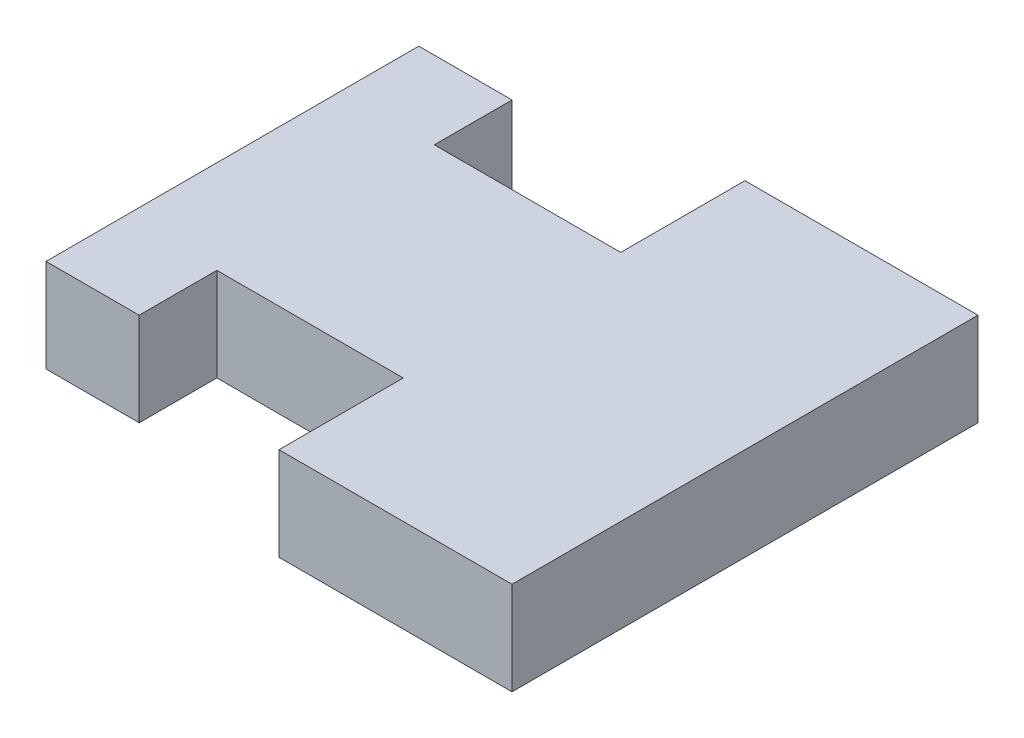
ISO-10303-21;
HEADER;
FILE_DESCRIPTION(('STEP AP214'),'2;1');
FILE_NAME('part.step','',(''),(''),'','','');
FILE_SCHEMA(('AUTOMOTIVE_DESIGN { 1 0 10303 214 1 1 1 1 }'));
ENDSEC;
DATA;
#1=APPLICATION_CONTEXT('core data for automotive mechanical design processes');
#2=APPLICATION_PROTOCOL_DEFINITION('international standard','automotive_design',2000,#1);
#3=PRODUCT_CONTEXT('',#1,'mechanical');
#4=PRODUCT('Part','Part','',(#3));
#5=PRODUCT_RELATED_PRODUCT_CATEGORY('part','',(#4));
#6=PRODUCT_DEFINITION_FORMATION('','',#4);
#7=PRODUCT_DEFINITION_CONTEXT('part definition',#1,'design');
#8=PRODUCT_DEFINITION('design','',#6,#7);
#9=PRODUCT_DEFINITION_SHAPE('','',#8);
#10=(LENGTH_UNIT() NAMED_UNIT(*) SI_UNIT(.MILLI.,.METRE.));
#11=(NAMED_UNIT(*) PLANE_ANGLE_UNIT() SI_UNIT($,.RADIAN.));
#12=(NAMED_UNIT(*) SI_UNIT($,.STERADIAN.) SOLID_ANGLE_UNIT());
#13=UNCERTAINTY_MEASURE_WITH_UNIT(LENGTH_MEASURE(1.E-05),#10,'distance_accuracy_value','');
#14=(GEOMETRIC_REPRESENTATION_CONTEXT(3) GLOBAL_UNCERTAINTY_ASSIGNED_CONTEXT((#13)) GLOBAL_UNIT_ASSIGNED_CONTEXT((#10,
#11,#12)) REPRESENTATION_CONTEXT('',''));
#15=CARTESIAN_POINT('',(0.,0.,0.));
#16=DIRECTION('',(0.,0.,1.));
#17=DIRECTION('',(1.,0.,0.));
#18=AXIS2_PLACEMENT_3D('',#15,#16,#17);
#19=CARTESIAN_POINT('',(0.,0.3,-1.49999999999998));
#20=DIRECTION('',(-1.,0.,0.));
#21=DIRECTION('',(0.,0.,1.));
#22=AXIS2_PLACEMENT_3D('',#19,#20,#21);
#23=PLANE('',#22);
#24=DIRECTION('',(0.,0.,-1.));
#25=VECTOR('',#24,1.);
#26=CARTESIAN_POINT('',(0.,0.,-1.49999999999998));
#27=LINE('',#26,#25);
#28=CARTESIAN_POINT('',(0.,0.,0.));
#29=VERTEX_POINT('',#28);
#30=CARTESIAN_POINT('',(0.,0.,-1.49999999999998));
#31=VERTEX_POINT('',#30);
#32=EDGE_CURVE('E189',#29,#31,#27,.T.);
#33=ORIENTED_EDGE('',*,*,#32,.T.);
#34=DIRECTION('',(0.,-1.,0.));
#35=VECTOR('',#34,1.);
#36=CARTESIAN_POINT('',(0.,0.3,-1.49999999999998));
#37=LINE('',#36,#35);
#38=CARTESIAN_POINT('',(0.,0.3,-1.49999999999998));
#39=VERTEX_POINT('',#38);
#40=EDGE_CURVE('E11',#39,#31,#37,.T.);
#41=ORIENTED_EDGE('',*,*,#40,.F.);
#42=DIRECTION('',(0.,0.,-1.));
#43=VECTOR('',#42,1.);
#44=CARTESIAN_POINT('',(0.,0.3,-1.49999999999998));
#45=LINE('',#44,#43);
#46=CARTESIAN_POINT('',(0.,0.3,0.));
#47=VERTEX_POINT('',#46);
#48=EDGE_CURVE('E222',#47,#39,#45,.T.);
#49=ORIENTED_EDGE('',*,*,#48,.F.);
#50=DIRECTION('',(0.,-1.,0.));
#51=VECTOR('',#50,1.);
#52=CARTESIAN_POINT('',(0.,0.3,0.));
#53=LINE('',#52,#51);
#54=EDGE_CURVE('E185',#47,#29,#53,.T.);
#55=ORIENTED_EDGE('',*,*,#54,.T.);
#56=EDGE_LOOP('',(#33,#41,#49,#55));
#57=FACE_BOUND('',#56,.T.);
#58=ADVANCED_FACE('F39',(#57),#23,.F.);
#59=CARTESIAN_POINT('',(0.,0.3,-1.49999999999998));
#60=DIRECTION('',(0.,0.,1.));
#61=DIRECTION('',(1.,0.,0.));
#62=AXIS2_PLACEMENT_3D('',#59,#60,#61);
#63=PLANE('',#62);
#64=DIRECTION('',(-1.,0.,0.));
#65=VECTOR('',#64,1.);
#66=CARTESIAN_POINT('',(0.,0.,-1.49999999999998));
#67=LINE('',#66,#65);
#68=CARTESIAN_POINT('',(-0.75,0.,-1.49999999999998));
#69=VERTEX_POINT('',#68);
#70=EDGE_CURVE('E193',#31,#69,#67,.T.);
#71=ORIENTED_EDGE('',*,*,#70,.T.);
#72=DIRECTION('',(0.,-1.,0.));
#73=VECTOR('',#72,1.);
#74=CARTESIAN_POINT('',(-0.75,0.3,-1.49999999999998));
#75=LINE('',#74,#73);
#76=CARTESIAN_POINT('',(-0.75,0.3,-1.49999999999998));
#77=VERTEX_POINT('',#76);
#78=EDGE_CURVE('E48',#77,#69,#75,.T.);
#79=ORIENTED_EDGE('',*,*,#78,.F.);
#80=DIRECTION('',(-1.,0.,0.));
#81=VECTOR('',#80,1.);
#82=CARTESIAN_POINT('',(0.,0.3,-1.49999999999998));
#83=LINE('',#82,#81);
#84=EDGE_CURVE('E126',#39,#77,#83,.T.);
#85=ORIENTED_EDGE('',*,*,#84,.F.);
#86=ORIENTED_EDGE('',*,*,#40,.T.);
#87=EDGE_LOOP('',(#71,#79,#85,#86));
#88=FACE_BOUND('',#87,.T.);
#89=ADVANCED_FACE('F316',(#88),#63,.F.);
#90=CARTESIAN_POINT('',(-0.75,0.3,-1.49999999999998));
#91=DIRECTION('',(1.,0.,0.));
#92=DIRECTION('',(0.,0.,-1.));
#93=AXIS2_PLACEMENT_3D('',#90,#91,#92);
#94=PLANE('',#93);
#95=DIRECTION('',(0.,0.,1.));
#96=VECTOR('',#95,1.);
#97=CARTESIAN_POINT('',(-0.75,0.,-1.49999999999998));
#98=LINE('',#97,#96);
#99=CARTESIAN_POINT('',(-0.75,0.,-1.09999999999999));
#100=VERTEX_POINT('',#99);
#101=EDGE_CURVE('E196',#69,#100,#98,.T.);
#102=ORIENTED_EDGE('',*,*,#101,.T.);
#103=DIRECTION('',(0.,-1.,0.));
#104=VECTOR('',#103,1.);
#105=CARTESIAN_POINT('',(-0.75,0.3,-1.09999999999999));
#106=LINE('',#105,#104);
#107=CARTESIAN_POINT('',(-0.75,0.3,-1.09999999999999));
#108=VERTEX_POINT('',#107);
#109=EDGE_CURVE('E249',#108,#100,#106,.T.);
#110=ORIENTED_EDGE('',*,*,#109,.F.);
#111=DIRECTION('',(0.,0.,1.));
#112=VECTOR('',#111,1.);
#113=CARTESIAN_POINT('',(-0.75,0.3,-1.49999999999998));
#114=LINE('',#113,#112);
#115=EDGE_CURVE('E259',#77,#108,#114,.T.);
#116=ORIENTED_EDGE('',*,*,#115,.F.);
#117=ORIENTED_EDGE('',*,*,#78,.T.);
#118=EDGE_LOOP('',(#102,#110,#116,#117));
#119=FACE_BOUND('',#118,.T.);
#120=ADVANCED_FACE('F257',(#119),#94,.F.);
#121=CARTESIAN_POINT('',(-0.75,0.3,-1.09999999999999));
#122=DIRECTION('',(0.,0.,1.));
#123=DIRECTION('',(1.,0.,0.));
#124=AXIS2_PLACEMENT_3D('',#121,#122,#123);
#125=PLANE('',#124);
#126=DIRECTION('',(-1.,0.,0.));
#127=VECTOR('',#126,1.);
#128=CARTESIAN_POINT('',(-0.75,0.,-1.09999999999999));
#129=LINE('',#128,#127);
#130=CARTESIAN_POINT('',(-1.35,0.,-1.09999999999999));
#131=VERTEX_POINT('',#130);
#132=EDGE_CURVE('E199',#100,#131,#129,.T.);
#133=ORIENTED_EDGE('',*,*,#132,.T.);
#134=DIRECTION('',(0.,-1.,0.));
#135=VECTOR('',#134,1.);
#136=CARTESIAN_POINT('',(-1.35,0.3,-1.09999999999999));
#137=LINE('',#136,#135);
#138=CARTESIAN_POINT('',(-1.35,0.3,-1.09999999999999));
#139=VERTEX_POINT('',#138);
#140=EDGE_CURVE('E245',#139,#131,#137,.T.);
#141=ORIENTED_EDGE('',*,*,#140,.F.);
#142=DIRECTION('',(-1.,0.,0.));
#143=VECTOR('',#142,1.);
#144=CARTESIAN_POINT('',(-0.75,0.3,-1.09999999999999));
#145=LINE('',#144,#143);
#146=EDGE_CURVE('E278',#108,#139,#145,.T.);
#147=ORIENTED_EDGE('',*,*,#146,.F.);
#148=ORIENTED_EDGE('',*,*,#109,.T.);
#149=EDGE_LOOP('',(#133,#141,#147,#148));
#150=FACE_BOUND('',#149,.T.);
#151=ADVANCED_FACE('F268',(#150),#125,.F.);
#152=CARTESIAN_POINT('',(-1.35,0.3,-1.34999999999999));
#153=DIRECTION('',(-1.,0.,0.));
#154=DIRECTION('',(0.,0.,1.));
#155=AXIS2_PLACEMENT_3D('',#152,#153,#154);
#156=PLANE('',#155);
#157=DIRECTION('',(0.,0.,-1.));
#158=VECTOR('',#157,1.);
#159=CARTESIAN_POINT('',(-1.35,0.,-1.34999999999999));
#160=LINE('',#159,#158);
#161=CARTESIAN_POINT('',(-1.35,0.,-1.34999999999999));
#162=VERTEX_POINT('',#161);
#163=EDGE_CURVE('E202',#131,#162,#160,.T.);
#164=ORIENTED_EDGE('',*,*,#163,.T.);
#165=DIRECTION('',(0.,-1.,0.));
#166=VECTOR('',#165,1.);
#167=CARTESIAN_POINT('',(-1.35,0.3,-1.34999999999999));
#168=LINE('',#167,#166);
#169=CARTESIAN_POINT('',(-1.35,0.3,-1.34999999999999));
#170=VERTEX_POINT('',#169);
#171=EDGE_CURVE('E241',#170,#162,#168,.T.);
#172=ORIENTED_EDGE('',*,*,#171,.F.);
#173=DIRECTION('',(0.,0.,-1.));
#174=VECTOR('',#173,1.);
#175=CARTESIAN_POINT('',(-1.35,0.3,-1.34999999999999));
#176=LINE('',#175,#174);
#177=EDGE_CURVE('E274',#139,#170,#176,.T.);
#178=ORIENTED_EDGE('',*,*,#177,.F.);
#179=ORIENTED_EDGE('',*,*,#140,.T.);
#180=EDGE_LOOP('',(#164,#172,#178,#179));
#181=FACE_BOUND('',#180,.T.);
#182=ADVANCED_FACE('F272',(#181),#156,.F.);
#183=CARTESIAN_POINT('',(-1.65,0.3,-1.34999999999999));
#184=DIRECTION('',(0.,0.,1.));
#185=DIRECTION('',(1.,0.,0.));
#186=AXIS2_PLACEMENT_3D('',#183,#184,#185);
#187=PLANE('',#186);
#188=DIRECTION('',(-1.,0.,0.));
#189=VECTOR('',#188,1.);
#190=CARTESIAN_POINT('',(-1.65,0.,-1.34999999999999));
#191=LINE('',#190,#189);
#192=CARTESIAN_POINT('',(-1.65,0.,-1.34999999999999));
#193=VERTEX_POINT('',#192);
#194=EDGE_CURVE('E205',#162,#193,#191,.T.);
#195=ORIENTED_EDGE('',*,*,#194,.T.);
#196=DIRECTION('',(0.,-1.,0.));
#197=VECTOR('',#196,1.);
#198=CARTESIAN_POINT('',(-1.65,0.3,-1.34999999999999));
#199=LINE('',#198,#197);
#200=CARTESIAN_POINT('',(-1.65,0.3,-1.34999999999999));
#201=VERTEX_POINT('',#200);
#202=EDGE_CURVE('E237',#201,#193,#199,.T.);
#203=ORIENTED_EDGE('',*,*,#202,.F.);
#204=DIRECTION('',(-1.,0.,0.));
#205=VECTOR('',#204,1.);
#206=CARTESIAN_POINT('',(-1.65,0.3,-1.34999999999999));
#207=LINE('',#206,#205);
#208=EDGE_CURVE('E277',#170,#201,#207,.T.);
#209=ORIENTED_EDGE('',*,*,#208,.F.);
#210=ORIENTED_EDGE('',*,*,#171,.T.);
#211=EDGE_LOOP('',(#195,#203,#209,#210));
#212=FACE_BOUND('',#211,.T.);
#213=ADVANCED_FACE('F329',(#212),#187,.F.);
#214=CARTESIAN_POINT('',(-1.65,0.3,-0.149999999999992));
#215=DIRECTION('',(1.,0.,0.));
#216=DIRECTION('',(0.,0.,-1.));
#217=AXIS2_PLACEMENT_3D('',#214,#215,#216);
#218=PLANE('',#217);
#219=DIRECTION('',(0.,0.,1.));
#220=VECTOR('',#219,1.);
#221=CARTESIAN_POINT('',(-1.65,0.,-0.149999999999992));
#222=LINE('',#221,#220);
#223=CARTESIAN_POINT('',(-1.65,0.,-0.149999999999992));
#224=VERTEX_POINT('',#223);
#225=EDGE_CURVE('E208',#193,#224,#222,.T.);
#226=ORIENTED_EDGE('',*,*,#225,.T.);
#227=DIRECTION('',(0.,-1.,0.));
#228=VECTOR('',#227,1.);
#229=CARTESIAN_POINT('',(-1.65,0.3,-0.149999999999992));
#230=LINE('',#229,#228);
#231=CARTESIAN_POINT('',(-1.65,0.3,-0.149999999999992));
#232=VERTEX_POINT('',#231);
#233=EDGE_CURVE('E233',#232,#224,#230,.T.);
#234=ORIENTED_EDGE('',*,*,#233,.F.);
#235=DIRECTION('',(0.,0.,1.));
#236=VECTOR('',#235,1.);
#237=CARTESIAN_POINT('',(-1.65,0.3,-0.149999999999992));
#238=LINE('',#237,#236);
#239=EDGE_CURVE('E281',#201,#232,#238,.T.);
#240=ORIENTED_EDGE('',*,*,#239,.F.);
#241=ORIENTED_EDGE('',*,*,#202,.T.);
#242=EDGE_LOOP('',(#226,#234,#240,#241));
#243=FACE_BOUND('',#242,.T.);
#244=ADVANCED_FACE('F332',(#243),#218,.F.);
#245=CARTESIAN_POINT('',(-1.35,0.3,-0.149999999999992));
#246=DIRECTION('',(0.,0.,-1.));
#247=DIRECTION('',(-1.,0.,0.));
#248=AXIS2_PLACEMENT_3D('',#245,#246,#247);
#249=PLANE('',#248);
#250=DIRECTION('',(1.,0.,0.));
#251=VECTOR('',#250,1.);
#252=CARTESIAN_POINT('',(-1.35,0.,-0.149999999999992));
#253=LINE('',#252,#251);
#254=CARTESIAN_POINT('',(-1.35,0.,-0.149999999999992));
#255=VERTEX_POINT('',#254);
#256=EDGE_CURVE('E211',#224,#255,#253,.T.);
#257=ORIENTED_EDGE('',*,*,#256,.T.);
#258=DIRECTION('',(0.,-1.,0.));
#259=VECTOR('',#258,1.);
#260=CARTESIAN_POINT('',(-1.35,0.3,-0.149999999999992));
#261=LINE('',#260,#259);
#262=CARTESIAN_POINT('',(-1.35,0.3,-0.149999999999992));
#263=VERTEX_POINT('',#262);
#264=EDGE_CURVE('E229',#263,#255,#261,.T.);
#265=ORIENTED_EDGE('',*,*,#264,.F.);
#266=DIRECTION('',(1.,0.,0.));
#267=VECTOR('',#266,1.);
#268=CARTESIAN_POINT('',(-1.35,0.3,-0.149999999999992));
#269=LINE('',#268,#267);
#270=EDGE_CURVE('E289',#232,#263,#269,.T.);
#271=ORIENTED_EDGE('',*,*,#270,.F.);
#272=ORIENTED_EDGE('',*,*,#233,.T.);
#273=EDGE_LOOP('',(#257,#265,#271,#272));
#274=FACE_BOUND('',#273,.T.);
#275=ADVANCED_FACE('F297',(#274),#249,.F.);
#276=CARTESIAN_POINT('',(-1.35,0.3,-0.399999999999992));
#277=DIRECTION('',(-1.,0.,0.));
#278=DIRECTION('',(0.,0.,1.));
#279=AXIS2_PLACEMENT_3D('',#276,#277,#278);
#280=PLANE('',#279);
#281=DIRECTION('',(0.,0.,-1.));
#282=VECTOR('',#281,1.);
#283=CARTESIAN_POINT('',(-1.35,0.,-0.399999999999992));
#284=LINE('',#283,#282);
#285=CARTESIAN_POINT('',(-1.35,0.,-0.399999999999992));
#286=VERTEX_POINT('',#285);
#287=EDGE_CURVE('E213',#255,#286,#284,.T.);
#288=ORIENTED_EDGE('',*,*,#287,.T.);
#289=DIRECTION('',(0.,-1.,0.));
#290=VECTOR('',#289,1.);
#291=CARTESIAN_POINT('',(-1.35,0.3,-0.399999999999992));
#292=LINE('',#291,#290);
#293=CARTESIAN_POINT('',(-1.35,0.3,-0.399999999999992));
#294=VERTEX_POINT('',#293);
#295=EDGE_CURVE('E177',#294,#286,#292,.T.);
#296=ORIENTED_EDGE('',*,*,#295,.F.);
#297=DIRECTION('',(0.,0.,-1.));
#298=VECTOR('',#297,1.);
#299=CARTESIAN_POINT('',(-1.35,0.3,-0.399999999999992));
#300=LINE('',#299,#298);
#301=EDGE_CURVE('E166',#263,#294,#300,.T.);
#302=ORIENTED_EDGE('',*,*,#301,.F.);
#303=ORIENTED_EDGE('',*,*,#264,.T.);
#304=EDGE_LOOP('',(#288,#296,#302,#303));
#305=FACE_BOUND('',#304,.T.);
#306=ADVANCED_FACE('F301',(#305),#280,.F.);
#307=CARTESIAN_POINT('',(-1.35,0.3,-0.399999999999992));
#308=DIRECTION('',(0.,0.,-1.));
#309=DIRECTION('',(-1.,0.,0.));
#310=AXIS2_PLACEMENT_3D('',#307,#308,#309);
#311=PLANE('',#310);
#312=DIRECTION('',(1.,0.,0.));
#313=VECTOR('',#312,1.);
#314=CARTESIAN_POINT('',(-1.35,0.,-0.399999999999992));
#315=LINE('',#314,#313);
#316=CARTESIAN_POINT('',(-0.75,0.,-0.399999999999992));
#317=VERTEX_POINT('',#316);
#318=EDGE_CURVE('E175',#286,#317,#315,.T.);
#319=ORIENTED_EDGE('',*,*,#318,.T.);
#320=DIRECTION('',(0.,-1.,0.));
#321=VECTOR('',#320,1.);
#322=CARTESIAN_POINT('',(-0.75,0.3,-0.399999999999992));
#323=LINE('',#322,#321);
#324=CARTESIAN_POINT('',(-0.75,0.3,-0.399999999999992));
#325=VERTEX_POINT('',#324);
#326=EDGE_CURVE('E172',#325,#317,#323,.T.);
#327=ORIENTED_EDGE('',*,*,#326,.F.);
#328=DIRECTION('',(1.,0.,0.));
#329=VECTOR('',#328,1.);
#330=CARTESIAN_POINT('',(-1.35,0.3,-0.399999999999992));
#331=LINE('',#330,#329);
#332=EDGE_CURVE('E160',#294,#325,#331,.T.);
#333=ORIENTED_EDGE('',*,*,#332,.F.);
#334=ORIENTED_EDGE('',*,*,#295,.T.);
#335=EDGE_LOOP('',(#319,#327,#333,#334));
#336=FACE_BOUND('',#335,.T.);
#337=ADVANCED_FACE('F173',(#336),#311,.F.);
#338=CARTESIAN_POINT('',(-0.75,0.3,-0.399999999999992));
#339=DIRECTION('',(1.,0.,0.));
#340=DIRECTION('',(0.,0.,-1.));
#341=AXIS2_PLACEMENT_3D('',#338,#339,#340);
#342=PLANE('',#341);
#343=DIRECTION('',(0.,0.,1.));
#344=VECTOR('',#343,1.);
#345=CARTESIAN_POINT('',(-0.75,0.,-0.399999999999992));
#346=LINE('',#345,#344);
#347=CARTESIAN_POINT('',(-0.75,0.,0.));
#348=VERTEX_POINT('',#347);
#349=EDGE_CURVE('E111',#317,#348,#346,.T.);
#350=ORIENTED_EDGE('',*,*,#349,.T.);
#351=DIRECTION('',(0.,-1.,0.));
#352=VECTOR('',#351,1.);
#353=CARTESIAN_POINT('',(-0.75,0.3,0.));
#354=LINE('',#353,#352);
#355=CARTESIAN_POINT('',(-0.75,0.3,0.));
#356=VERTEX_POINT('',#355);
#357=EDGE_CURVE('E178',#356,#348,#354,.T.);
#358=ORIENTED_EDGE('',*,*,#357,.F.);
#359=DIRECTION('',(0.,0.,1.));
#360=VECTOR('',#359,1.);
#361=CARTESIAN_POINT('',(-0.75,0.3,-0.399999999999992));
#362=LINE('',#361,#360);
#363=EDGE_CURVE('E164',#325,#356,#362,.T.);
#364=ORIENTED_EDGE('',*,*,#363,.F.);
#365=ORIENTED_EDGE('',*,*,#326,.T.);
#366=EDGE_LOOP('',(#350,#358,#364,#365));
#367=FACE_BOUND('',#366,.T.);
#368=ADVANCED_FACE('F180',(#367),#342,.F.);
#369=CARTESIAN_POINT('',(-0.75,0.3,0.));
#370=DIRECTION('',(0.,0.,-1.));
#371=DIRECTION('',(-1.,0.,0.));
#372=AXIS2_PLACEMENT_3D('',#369,#370,#371);
#373=PLANE('',#372);
#374=DIRECTION('',(1.,0.,0.));
#375=VECTOR('',#374,1.);
#376=CARTESIAN_POINT('',(-0.75,0.,0.));
#377=LINE('',#376,#375);
#378=EDGE_CURVE('E117',#348,#29,#377,.T.);
#379=ORIENTED_EDGE('',*,*,#378,.T.);
#380=ORIENTED_EDGE('',*,*,#54,.F.);
#381=DIRECTION('',(1.,0.,0.));
#382=VECTOR('',#381,1.);
#383=CARTESIAN_POINT('',(-0.75,0.3,0.));
#384=LINE('',#383,#382);
#385=EDGE_CURVE('E59',#356,#47,#384,.T.);
#386=ORIENTED_EDGE('',*,*,#385,.F.);
#387=ORIENTED_EDGE('',*,*,#357,.T.);
#388=EDGE_LOOP('',(#379,#380,#386,#387));
#389=FACE_BOUND('',#388,.T.);
#390=ADVANCED_FACE('F305',(#389),#373,.F.);
#391=CARTESIAN_POINT('',(0.,0.3,0.));
#392=DIRECTION('',(0.,1.,0.));
#393=DIRECTION('',(0.,0.,1.));
#394=AXIS2_PLACEMENT_3D('',#391,#392,#393);
#395=PLANE('',#394);
#396=ORIENTED_EDGE('',*,*,#48,.T.);
#397=ORIENTED_EDGE('',*,*,#84,.T.);
#398=ORIENTED_EDGE('',*,*,#115,.T.);
#399=ORIENTED_EDGE('',*,*,#146,.T.);
#400=ORIENTED_EDGE('',*,*,#177,.T.);
#401=ORIENTED_EDGE('',*,*,#208,.T.);
#402=ORIENTED_EDGE('',*,*,#239,.T.);
#403=ORIENTED_EDGE('',*,*,#270,.T.);
#404=ORIENTED_EDGE('',*,*,#301,.T.);
#405=ORIENTED_EDGE('',*,*,#332,.T.);
#406=ORIENTED_EDGE('',*,*,#363,.T.);
#407=ORIENTED_EDGE('',*,*,#385,.T.);
#408=EDGE_LOOP('',(#396,#397,#398,#399,#400,#401,#402,#403,#404,#405,#406,#407));
#409=FACE_BOUND('',#408,.T.);
#410=ADVANCED_FACE('F162',(#409),#395,.T.);
#411=CARTESIAN_POINT('',(0.,0.,0.));
#412=DIRECTION('',(0.,1.,0.));
#413=DIRECTION('',(0.,0.,1.));
#414=AXIS2_PLACEMENT_3D('',#411,#412,#413);
#415=PLANE('',#414);
#416=ORIENTED_EDGE('',*,*,#32,.F.);
#417=ORIENTED_EDGE('',*,*,#378,.F.);
#418=ORIENTED_EDGE('',*,*,#349,.F.);
#419=ORIENTED_EDGE('',*,*,#318,.F.);
#420=ORIENTED_EDGE('',*,*,#287,.F.);
#421=ORIENTED_EDGE('',*,*,#256,.F.);
#422=ORIENTED_EDGE('',*,*,#225,.F.);
#423=ORIENTED_EDGE('',*,*,#194,.F.);
#424=ORIENTED_EDGE('',*,*,#163,.F.);
#425=ORIENTED_EDGE('',*,*,#132,.F.);
#426=ORIENTED_EDGE('',*,*,#101,.F.);
#427=ORIENTED_EDGE('',*,*,#70,.F.);
#428=EDGE_LOOP('',(#416,#417,#418,#419,#420,#421,#422,#423,#424,#425,#426,#427));
#429=FACE_BOUND('',#428,.T.);
#430=ADVANCED_FACE('F263',(#429),#415,.F.);
#431=CLOSED_SHELL('',(#58,#89,#120,#151,#182,#213,#244,#275,#306,#337,#368,#390,#410,#430));
#432=MANIFOLD_SOLID_BREP('B2',#431);
#433=ADVANCED_BREP_SHAPE_REPRESENTATION('',(#18,#432),#14);
#434=SHAPE_DEFINITION_REPRESENTATION(#9,#433);
ENDSEC;
END-ISO-10303-21;
